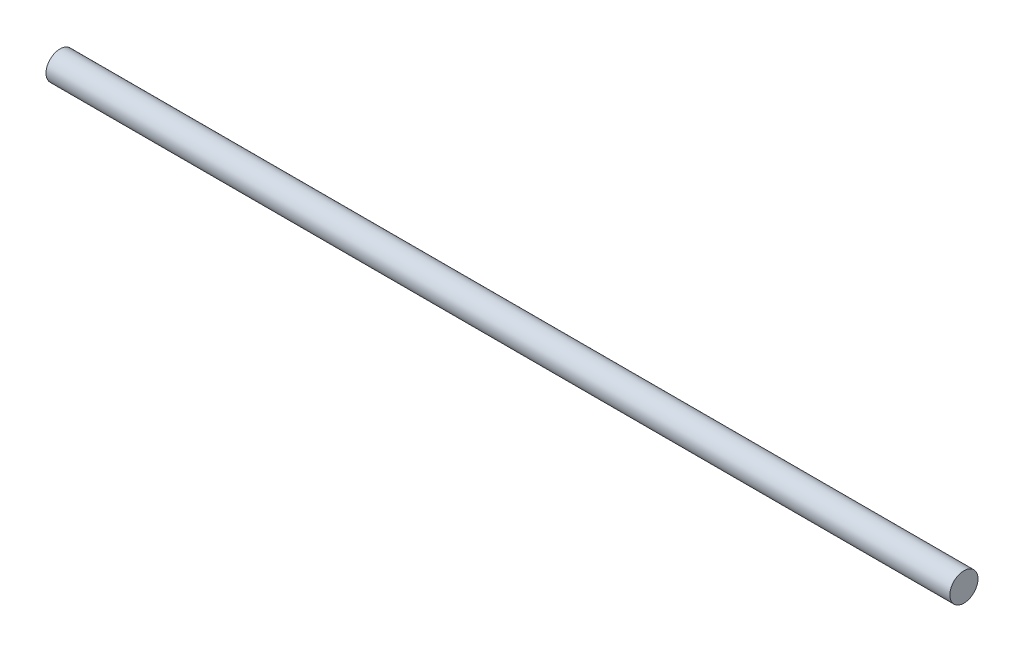
ISO-10303-21;
HEADER;
FILE_DESCRIPTION(('STEP AP214'),'2;1');
FILE_NAME('part.step','',(''),(''),'','','');
FILE_SCHEMA(('AUTOMOTIVE_DESIGN { 1 0 10303 214 1 1 1 1 }'));
ENDSEC;
DATA;
#1=APPLICATION_CONTEXT('core data for automotive mechanical design processes');
#2=APPLICATION_PROTOCOL_DEFINITION('international standard','automotive_design',2000,#1);
#3=PRODUCT_CONTEXT('',#1,'mechanical');
#4=PRODUCT('Part','Part','',(#3));
#5=PRODUCT_RELATED_PRODUCT_CATEGORY('part','',(#4));
#6=PRODUCT_DEFINITION_FORMATION('','',#4);
#7=PRODUCT_DEFINITION_CONTEXT('part definition',#1,'design');
#8=PRODUCT_DEFINITION('design','',#6,#7);
#9=PRODUCT_DEFINITION_SHAPE('','',#8);
#10=(LENGTH_UNIT() NAMED_UNIT(*) SI_UNIT(.MILLI.,.METRE.));
#11=(NAMED_UNIT(*) PLANE_ANGLE_UNIT() SI_UNIT($,.RADIAN.));
#12=(NAMED_UNIT(*) SI_UNIT($,.STERADIAN.) SOLID_ANGLE_UNIT());
#13=UNCERTAINTY_MEASURE_WITH_UNIT(LENGTH_MEASURE(1.E-05),#10,'distance_accuracy_value','');
#14=(GEOMETRIC_REPRESENTATION_CONTEXT(3) GLOBAL_UNCERTAINTY_ASSIGNED_CONTEXT((#13)) GLOBAL_UNIT_ASSIGNED_CONTEXT((#10,
#11,#12)) REPRESENTATION_CONTEXT('',''));
#15=CARTESIAN_POINT('',(0.,0.,0.));
#16=DIRECTION('',(0.,0.,1.));
#17=DIRECTION('',(1.,0.,0.));
#18=AXIS2_PLACEMENT_3D('',#15,#16,#17);
#19=CARTESIAN_POINT('',(160.5,0.,0.));
#20=DIRECTION('',(-1.,0.,0.));
#21=DIRECTION('',(0.,0.,1.));
#22=AXIS2_PLACEMENT_3D('',#19,#20,#21);
#23=CYLINDRICAL_SURFACE('',#22,5.);
#24=CARTESIAN_POINT('',(160.5,0.,0.));
#25=DIRECTION('',(1.,0.,0.));
#26=DIRECTION('',(0.,0.,-1.));
#27=AXIS2_PLACEMENT_3D('',#24,#25,#26);
#28=CIRCLE('',#27,5.);
#29=CARTESIAN_POINT('',(160.5,0.,-5.));
#30=VERTEX_POINT('',#29);
#31=EDGE_CURVE('E10',#30,#30,#28,.T.);
#32=ORIENTED_EDGE('',*,*,#31,.F.);
#33=EDGE_LOOP('',(#32));
#34=FACE_BOUND('',#33,.T.);
#35=CARTESIAN_POINT('',(-160.5,0.,0.));
#36=DIRECTION('',(1.,0.,0.));
#37=DIRECTION('',(0.,0.,-1.));
#38=AXIS2_PLACEMENT_3D('',#35,#36,#37);
#39=CIRCLE('',#38,5.);
#40=CARTESIAN_POINT('',(-160.5,0.,-5.));
#41=VERTEX_POINT('',#40);
#42=EDGE_CURVE('E34',#41,#41,#39,.T.);
#43=ORIENTED_EDGE('',*,*,#42,.T.);
#44=EDGE_LOOP('',(#43));
#45=FACE_BOUND('',#44,.T.);
#46=ADVANCED_FACE('F31',(#34,#45),#23,.T.);
#47=CARTESIAN_POINT('',(160.5,0.,0.));
#48=DIRECTION('',(1.,0.,0.));
#49=DIRECTION('',(0.,0.,-1.));
#50=AXIS2_PLACEMENT_3D('',#47,#48,#49);
#51=PLANE('',#50);
#52=ORIENTED_EDGE('',*,*,#31,.T.);
#53=EDGE_LOOP('',(#52));
#54=FACE_BOUND('',#53,.T.);
#55=ADVANCED_FACE('F46',(#54),#51,.T.);
#56=CARTESIAN_POINT('',(-160.5,0.,0.));
#57=DIRECTION('',(1.,0.,0.));
#58=DIRECTION('',(0.,0.,-1.));
#59=AXIS2_PLACEMENT_3D('',#56,#57,#58);
#60=PLANE('',#59);
#61=ORIENTED_EDGE('',*,*,#42,.F.);
#62=EDGE_LOOP('',(#61));
#63=FACE_BOUND('',#62,.T.);
#64=ADVANCED_FACE('F44',(#63),#60,.F.);
#65=CLOSED_SHELL('',(#46,#55,#64));
#66=MANIFOLD_SOLID_BREP('B2',#65);
#67=ADVANCED_BREP_SHAPE_REPRESENTATION('',(#18,#66),#14);
#68=SHAPE_DEFINITION_REPRESENTATION(#9,#67);
ENDSEC;
END-ISO-10303-21;
